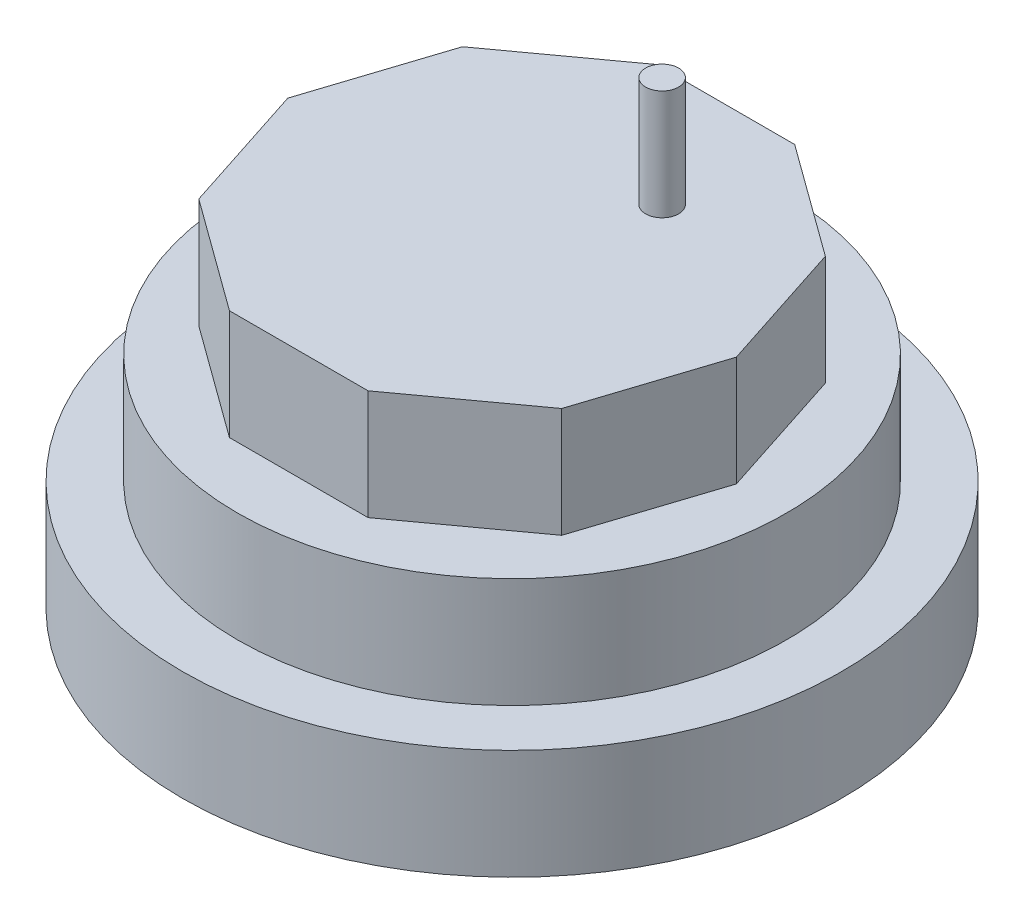
ISO-10303-21;
HEADER;
FILE_DESCRIPTION(('STEP AP214'),'2;1');
FILE_NAME('part.step','',(''),(''),'','','');
FILE_SCHEMA(('AUTOMOTIVE_DESIGN { 1 0 10303 214 1 1 1 1 }'));
ENDSEC;
DATA;
#1=APPLICATION_CONTEXT('core data for automotive mechanical design processes');
#2=APPLICATION_PROTOCOL_DEFINITION('international standard','automotive_design',2000,#1);
#3=PRODUCT_CONTEXT('',#1,'mechanical');
#4=PRODUCT('Part','Part','',(#3));
#5=PRODUCT_RELATED_PRODUCT_CATEGORY('part','',(#4));
#6=PRODUCT_DEFINITION_FORMATION('','',#4);
#7=PRODUCT_DEFINITION_CONTEXT('part definition',#1,'design');
#8=PRODUCT_DEFINITION('design','',#6,#7);
#9=PRODUCT_DEFINITION_SHAPE('','',#8);
#10=(LENGTH_UNIT() NAMED_UNIT(*) SI_UNIT(.MILLI.,.METRE.));
#11=(NAMED_UNIT(*) PLANE_ANGLE_UNIT() SI_UNIT($,.RADIAN.));
#12=(NAMED_UNIT(*) SI_UNIT($,.STERADIAN.) SOLID_ANGLE_UNIT());
#13=UNCERTAINTY_MEASURE_WITH_UNIT(LENGTH_MEASURE(1.E-05),#10,'distance_accuracy_value','');
#14=(GEOMETRIC_REPRESENTATION_CONTEXT(3) GLOBAL_UNCERTAINTY_ASSIGNED_CONTEXT((#13)) GLOBAL_UNIT_ASSIGNED_CONTEXT((#10,
#11,#12)) REPRESENTATION_CONTEXT('',''));
#15=CARTESIAN_POINT('',(0.,0.,0.));
#16=DIRECTION('',(0.,0.,1.));
#17=DIRECTION('',(1.,0.,0.));
#18=AXIS2_PLACEMENT_3D('',#15,#16,#17);
#19=CARTESIAN_POINT('',(0.,25.4,0.));
#20=DIRECTION('',(0.,-1.,0.));
#21=DIRECTION('',(0.,0.,-1.));
#22=AXIS2_PLACEMENT_3D('',#19,#20,#21);
#23=CYLINDRICAL_SURFACE('',#22,76.2);
#24=CARTESIAN_POINT('',(0.,25.4,0.));
#25=DIRECTION('',(0.,1.,0.));
#26=DIRECTION('',(0.,0.,1.));
#27=AXIS2_PLACEMENT_3D('',#24,#25,#26);
#28=CIRCLE('',#27,76.2);
#29=CARTESIAN_POINT('',(0.,25.4,76.2));
#30=VERTEX_POINT('',#29);
#31=EDGE_CURVE('E49',#30,#30,#28,.T.);
#32=ORIENTED_EDGE('',*,*,#31,.F.);
#33=EDGE_LOOP('',(#32));
#34=FACE_BOUND('',#33,.T.);
#35=CARTESIAN_POINT('',(0.,0.,0.));
#36=DIRECTION('',(0.,1.,0.));
#37=DIRECTION('',(0.,0.,1.));
#38=AXIS2_PLACEMENT_3D('',#35,#36,#37);
#39=CIRCLE('',#38,76.2);
#40=CARTESIAN_POINT('',(0.,0.,76.2));
#41=VERTEX_POINT('',#40);
#42=EDGE_CURVE('E44',#41,#41,#39,.T.);
#43=ORIENTED_EDGE('',*,*,#42,.T.);
#44=EDGE_LOOP('',(#43));
#45=FACE_BOUND('',#44,.T.);
#46=ADVANCED_FACE('F41',(#34,#45),#23,.T.);
#47=CARTESIAN_POINT('',(0.,25.4,0.));
#48=DIRECTION('',(0.,1.,0.));
#49=DIRECTION('',(0.,0.,1.));
#50=AXIS2_PLACEMENT_3D('',#47,#48,#49);
#51=PLANE('',#50);
#52=CARTESIAN_POINT('',(0.,25.4,0.));
#53=DIRECTION('',(0.,1.,0.));
#54=DIRECTION('',(0.,0.,1.));
#55=AXIS2_PLACEMENT_3D('',#52,#53,#54);
#56=CIRCLE('',#55,63.5);
#57=CARTESIAN_POINT('',(0.,25.4,63.5));
#58=VERTEX_POINT('',#57);
#59=EDGE_CURVE('E11',#58,#58,#56,.T.);
#60=ORIENTED_EDGE('',*,*,#59,.F.);
#61=EDGE_LOOP('',(#60));
#62=FACE_BOUND('',#61,.T.);
#63=ORIENTED_EDGE('',*,*,#31,.T.);
#64=EDGE_LOOP('',(#63));
#65=FACE_BOUND('',#64,.T.);
#66=ADVANCED_FACE('F156',(#62,#65),#51,.T.);
#67=CARTESIAN_POINT('',(0.,0.,0.));
#68=DIRECTION('',(0.,1.,0.));
#69=DIRECTION('',(0.,0.,1.));
#70=AXIS2_PLACEMENT_3D('',#67,#68,#69);
#71=PLANE('',#70);
#72=ORIENTED_EDGE('',*,*,#42,.F.);
#73=EDGE_LOOP('',(#72));
#74=FACE_BOUND('',#73,.T.);
#75=ADVANCED_FACE('F153',(#74),#71,.F.);
#76=CARTESIAN_POINT('',(0.,50.8,0.));
#77=DIRECTION('',(0.,-1.,0.));
#78=DIRECTION('',(0.,0.,-1.));
#79=AXIS2_PLACEMENT_3D('',#76,#77,#78);
#80=CYLINDRICAL_SURFACE('',#79,63.5);
#81=CARTESIAN_POINT('',(0.,50.8,0.));
#82=DIRECTION('',(0.,1.,0.));
#83=DIRECTION('',(0.,0.,1.));
#84=AXIS2_PLACEMENT_3D('',#81,#82,#83);
#85=CIRCLE('',#84,63.5);
#86=CARTESIAN_POINT('',(0.,50.8,63.5));
#87=VERTEX_POINT('',#86);
#88=EDGE_CURVE('E139',#87,#87,#85,.T.);
#89=ORIENTED_EDGE('',*,*,#88,.F.);
#90=EDGE_LOOP('',(#89));
#91=FACE_BOUND('',#90,.T.);
#92=ORIENTED_EDGE('',*,*,#59,.T.);
#93=EDGE_LOOP('',(#92));
#94=FACE_BOUND('',#93,.T.);
#95=ADVANCED_FACE('F155',(#91,#94),#80,.T.);
#96=CARTESIAN_POINT('',(0.,50.8,0.));
#97=DIRECTION('',(0.,1.,0.));
#98=DIRECTION('',(0.,0.,1.));
#99=AXIS2_PLACEMENT_3D('',#96,#97,#98);
#100=PLANE('',#99);
#101=DIRECTION('',(0.80901699437495,0.,-0.58778525229247));
#102=VECTOR('',#101,1.);
#103=CARTESIAN_POINT('',(16.024284297391,50.8,49.3176759770969));
#104=LINE('',#103,#102);
#105=CARTESIAN_POINT('',(16.024284297391,50.8,49.3176759770969));
#106=VERTEX_POINT('',#105);
#107=CARTESIAN_POINT('',(41.9521209359614,50.8,30.4800000000002));
#108=VERTEX_POINT('',#107);
#109=EDGE_CURVE('E57',#106,#108,#104,.T.);
#110=ORIENTED_EDGE('',*,*,#109,.F.);
#111=DIRECTION('',(1.,0.,0.));
#112=VECTOR('',#111,1.);
#113=CARTESIAN_POINT('',(-16.0242842973913,50.8,49.3176759770968));
#114=LINE('',#113,#112);
#115=CARTESIAN_POINT('',(-16.0242842973913,50.8,49.3176759770968));
#116=VERTEX_POINT('',#115);
#117=EDGE_CURVE('E61',#116,#106,#114,.T.);
#118=ORIENTED_EDGE('',*,*,#117,.F.);
#119=DIRECTION('',(0.809016994374946,0.,0.587785252292476));
#120=VECTOR('',#119,1.);
#121=CARTESIAN_POINT('',(-41.9521209359615,50.8,30.4799999999999));
#122=LINE('',#121,#120);
#123=CARTESIAN_POINT('',(-41.9521209359615,50.8,30.4799999999999));
#124=VERTEX_POINT('',#123);
#125=EDGE_CURVE('E403',#124,#116,#122,.T.);
#126=ORIENTED_EDGE('',*,*,#125,.F.);
#127=DIRECTION('',(0.309016994374944,0.,0.951056516295155));
#128=VECTOR('',#127,1.);
#129=CARTESIAN_POINT('',(-51.8556732771404,50.8,-1.89084858881472E-13));
#130=LINE('',#129,#128);
#131=CARTESIAN_POINT('',(-51.8556732771404,50.8,-1.89084858881472E-13));
#132=VERTEX_POINT('',#131);
#133=EDGE_CURVE('E400',#132,#124,#130,.T.);
#134=ORIENTED_EDGE('',*,*,#133,.F.);
#135=DIRECTION('',(-0.30901699437495,0.,0.951056516295153));
#136=VECTOR('',#135,1.);
#137=CARTESIAN_POINT('',(-41.9521209359614,50.8,-30.4800000000002));
#138=LINE('',#137,#136);
#139=CARTESIAN_POINT('',(-41.9521209359614,50.8,-30.4800000000002));
#140=VERTEX_POINT('',#139);
#141=EDGE_CURVE('E397',#140,#132,#138,.T.);
#142=ORIENTED_EDGE('',*,*,#141,.F.);
#143=DIRECTION('',(-0.809016994374949,0.,0.58778525229247));
#144=VECTOR('',#143,1.);
#145=CARTESIAN_POINT('',(-16.0242842973911,50.8,-49.3176759770969));
#146=LINE('',#145,#144);
#147=CARTESIAN_POINT('',(-16.0242842973911,50.8,-49.3176759770969));
#148=VERTEX_POINT('',#147);
#149=EDGE_CURVE('E394',#148,#140,#146,.T.);
#150=ORIENTED_EDGE('',*,*,#149,.F.);
#151=DIRECTION('',(-1.,0.,0.));
#152=VECTOR('',#151,1.);
#153=CARTESIAN_POINT('',(16.0242842973914,50.8,-49.3176759770968));
#154=LINE('',#153,#152);
#155=CARTESIAN_POINT('',(16.0242842973914,50.8,-49.3176759770968));
#156=VERTEX_POINT('',#155);
#157=EDGE_CURVE('E391',#156,#148,#154,.T.);
#158=ORIENTED_EDGE('',*,*,#157,.F.);
#159=DIRECTION('',(-0.809016994374946,0.,-0.587785252292475));
#160=VECTOR('',#159,1.);
#161=CARTESIAN_POINT('',(41.9521209359616,50.8,-30.4799999999999));
#162=LINE('',#161,#160);
#163=CARTESIAN_POINT('',(41.9521209359616,50.8,-30.4799999999999));
#164=VERTEX_POINT('',#163);
#165=EDGE_CURVE('E388',#164,#156,#162,.T.);
#166=ORIENTED_EDGE('',*,*,#165,.F.);
#167=DIRECTION('',(-0.309016994374944,0.,-0.951056516295155));
#168=VECTOR('',#167,1.);
#169=CARTESIAN_POINT('',(51.8556732771405,50.8,1.66317454907727E-13));
#170=LINE('',#169,#168);
#171=CARTESIAN_POINT('',(51.8556732771405,50.8,1.66317454907727E-13));
#172=VERTEX_POINT('',#171);
#173=EDGE_CURVE('E385',#172,#164,#170,.T.);
#174=ORIENTED_EDGE('',*,*,#173,.F.);
#175=DIRECTION('',(0.309016994374951,0.,-0.951056516295153));
#176=VECTOR('',#175,1.);
#177=CARTESIAN_POINT('',(41.9521209359614,50.8,30.4800000000002));
#178=LINE('',#177,#176);
#179=EDGE_CURVE('E364',#108,#172,#178,.T.);
#180=ORIENTED_EDGE('',*,*,#179,.F.);
#181=EDGE_LOOP('',(#110,#118,#126,#134,#142,#150,#158,#166,#174,#180));
#182=FACE_BOUND('',#181,.T.);
#183=ORIENTED_EDGE('',*,*,#88,.T.);
#184=EDGE_LOOP('',(#183));
#185=FACE_BOUND('',#184,.T.);
#186=ADVANCED_FACE('F161',(#182,#185),#100,.T.);
#187=CARTESIAN_POINT('',(16.024284297391,76.2,49.3176759770969));
#188=DIRECTION('',(-0.58778525229247,0.,-0.809016994374949));
#189=DIRECTION('',(-0.80901699437495,0.,0.58778525229247));
#190=AXIS2_PLACEMENT_3D('',#187,#188,#189);
#191=PLANE('',#190);
#192=ORIENTED_EDGE('',*,*,#109,.T.);
#193=DIRECTION('',(0.,-1.,0.));
#194=VECTOR('',#193,1.);
#195=CARTESIAN_POINT('',(41.9521209359614,76.2,30.4800000000002));
#196=LINE('',#195,#194);
#197=CARTESIAN_POINT('',(41.9521209359614,76.2,30.4800000000002));
#198=VERTEX_POINT('',#197);
#199=EDGE_CURVE('E122',#198,#108,#196,.T.);
#200=ORIENTED_EDGE('',*,*,#199,.F.);
#201=DIRECTION('',(0.80901699437495,0.,-0.58778525229247));
#202=VECTOR('',#201,1.);
#203=CARTESIAN_POINT('',(16.024284297391,76.2,49.3176759770969));
#204=LINE('',#203,#202);
#205=CARTESIAN_POINT('',(16.024284297391,76.2,49.3176759770969));
#206=VERTEX_POINT('',#205);
#207=EDGE_CURVE('E128',#206,#198,#204,.T.);
#208=ORIENTED_EDGE('',*,*,#207,.F.);
#209=DIRECTION('',(0.,-1.,0.));
#210=VECTOR('',#209,1.);
#211=CARTESIAN_POINT('',(16.024284297391,76.2,49.3176759770969));
#212=LINE('',#211,#210);
#213=EDGE_CURVE('E382',#206,#106,#212,.T.);
#214=ORIENTED_EDGE('',*,*,#213,.T.);
#215=EDGE_LOOP('',(#192,#200,#208,#214));
#216=FACE_BOUND('',#215,.T.);
#217=ADVANCED_FACE('F138',(#216),#191,.F.);
#218=CARTESIAN_POINT('',(41.9521209359614,76.2,30.4800000000002));
#219=DIRECTION('',(-0.951056516295153,0.,-0.309016994374951));
#220=DIRECTION('',(-0.309016994374951,0.,0.951056516295153));
#221=AXIS2_PLACEMENT_3D('',#218,#219,#220);
#222=PLANE('',#221);
#223=ORIENTED_EDGE('',*,*,#179,.T.);
#224=DIRECTION('',(0.,-1.,0.));
#225=VECTOR('',#224,1.);
#226=CARTESIAN_POINT('',(51.8556732771405,76.2,1.66317454907727E-13));
#227=LINE('',#226,#225);
#228=CARTESIAN_POINT('',(51.8556732771405,76.2,1.66317454907727E-13));
#229=VERTEX_POINT('',#228);
#230=EDGE_CURVE('E124',#229,#172,#227,.T.);
#231=ORIENTED_EDGE('',*,*,#230,.F.);
#232=DIRECTION('',(0.309016994374951,0.,-0.951056516295153));
#233=VECTOR('',#232,1.);
#234=CARTESIAN_POINT('',(41.9521209359614,76.2,30.4800000000002));
#235=LINE('',#234,#233);
#236=EDGE_CURVE('E117',#198,#229,#235,.T.);
#237=ORIENTED_EDGE('',*,*,#236,.F.);
#238=ORIENTED_EDGE('',*,*,#199,.T.);
#239=EDGE_LOOP('',(#223,#231,#237,#238));
#240=FACE_BOUND('',#239,.T.);
#241=ADVANCED_FACE('F120',(#240),#222,.F.);
#242=CARTESIAN_POINT('',(51.8556732771405,76.2,1.66317454907727E-13));
#243=DIRECTION('',(-0.951056516295154,0.,0.309016994374944));
#244=DIRECTION('',(0.309016994374944,0.,0.951056516295155));
#245=AXIS2_PLACEMENT_3D('',#242,#243,#244);
#246=PLANE('',#245);
#247=ORIENTED_EDGE('',*,*,#173,.T.);
#248=DIRECTION('',(0.,-1.,0.));
#249=VECTOR('',#248,1.);
#250=CARTESIAN_POINT('',(41.9521209359616,76.2,-30.4799999999999));
#251=LINE('',#250,#249);
#252=CARTESIAN_POINT('',(41.9521209359616,76.2,-30.4799999999999));
#253=VERTEX_POINT('',#252);
#254=EDGE_CURVE('E143',#253,#164,#251,.T.);
#255=ORIENTED_EDGE('',*,*,#254,.F.);
#256=DIRECTION('',(-0.309016994374944,0.,-0.951056516295155));
#257=VECTOR('',#256,1.);
#258=CARTESIAN_POINT('',(51.8556732771405,76.2,1.66317454907727E-13));
#259=LINE('',#258,#257);
#260=EDGE_CURVE('E127',#229,#253,#259,.T.);
#261=ORIENTED_EDGE('',*,*,#260,.F.);
#262=ORIENTED_EDGE('',*,*,#230,.T.);
#263=EDGE_LOOP('',(#247,#255,#261,#262));
#264=FACE_BOUND('',#263,.T.);
#265=ADVANCED_FACE('F211',(#264),#246,.F.);
#266=CARTESIAN_POINT('',(41.9521209359616,76.2,-30.4799999999999));
#267=DIRECTION('',(-0.587785252292475,0.,0.809016994374946));
#268=DIRECTION('',(0.809016994374946,0.,0.587785252292476));
#269=AXIS2_PLACEMENT_3D('',#266,#267,#268);
#270=PLANE('',#269);
#271=ORIENTED_EDGE('',*,*,#165,.T.);
#272=DIRECTION('',(0.,-1.,0.));
#273=VECTOR('',#272,1.);
#274=CARTESIAN_POINT('',(16.0242842973914,76.2,-49.3176759770968));
#275=LINE('',#274,#273);
#276=CARTESIAN_POINT('',(16.0242842973914,76.2,-49.3176759770968));
#277=VERTEX_POINT('',#276);
#278=EDGE_CURVE('E422',#277,#156,#275,.T.);
#279=ORIENTED_EDGE('',*,*,#278,.F.);
#280=DIRECTION('',(-0.809016994374946,0.,-0.587785252292475));
#281=VECTOR('',#280,1.);
#282=CARTESIAN_POINT('',(41.9521209359616,76.2,-30.4799999999999));
#283=LINE('',#282,#281);
#284=EDGE_CURVE('E370',#253,#277,#283,.T.);
#285=ORIENTED_EDGE('',*,*,#284,.F.);
#286=ORIENTED_EDGE('',*,*,#254,.T.);
#287=EDGE_LOOP('',(#271,#279,#285,#286));
#288=FACE_BOUND('',#287,.T.);
#289=ADVANCED_FACE('F221',(#288),#270,.F.);
#290=CARTESIAN_POINT('',(16.0242842973914,76.2,-49.3176759770968));
#291=DIRECTION('',(0.,0.,1.));
#292=DIRECTION('',(1.,0.,0.));
#293=AXIS2_PLACEMENT_3D('',#290,#291,#292);
#294=PLANE('',#293);
#295=ORIENTED_EDGE('',*,*,#157,.T.);
#296=DIRECTION('',(0.,-1.,0.));
#297=VECTOR('',#296,1.);
#298=CARTESIAN_POINT('',(-16.0242842973911,76.2,-49.3176759770969));
#299=LINE('',#298,#297);
#300=CARTESIAN_POINT('',(-16.0242842973911,76.2,-49.3176759770969));
#301=VERTEX_POINT('',#300);
#302=EDGE_CURVE('E419',#301,#148,#299,.T.);
#303=ORIENTED_EDGE('',*,*,#302,.F.);
#304=DIRECTION('',(-1.,0.,0.));
#305=VECTOR('',#304,1.);
#306=CARTESIAN_POINT('',(16.0242842973914,76.2,-49.3176759770968));
#307=LINE('',#306,#305);
#308=EDGE_CURVE('E372',#277,#301,#307,.T.);
#309=ORIENTED_EDGE('',*,*,#308,.F.);
#310=ORIENTED_EDGE('',*,*,#278,.T.);
#311=EDGE_LOOP('',(#295,#303,#309,#310));
#312=FACE_BOUND('',#311,.T.);
#313=ADVANCED_FACE('F232',(#312),#294,.F.);
#314=CARTESIAN_POINT('',(-16.0242842973911,76.2,-49.3176759770969));
#315=DIRECTION('',(0.58778525229247,0.,0.809016994374949));
#316=DIRECTION('',(0.80901699437495,0.,-0.58778525229247));
#317=AXIS2_PLACEMENT_3D('',#314,#315,#316);
#318=PLANE('',#317);
#319=ORIENTED_EDGE('',*,*,#149,.T.);
#320=DIRECTION('',(0.,-1.,0.));
#321=VECTOR('',#320,1.);
#322=CARTESIAN_POINT('',(-41.9521209359614,76.2,-30.4800000000002));
#323=LINE('',#322,#321);
#324=CARTESIAN_POINT('',(-41.9521209359614,76.2,-30.4800000000002));
#325=VERTEX_POINT('',#324);
#326=EDGE_CURVE('E416',#325,#140,#323,.T.);
#327=ORIENTED_EDGE('',*,*,#326,.F.);
#328=DIRECTION('',(-0.809016994374949,0.,0.58778525229247));
#329=VECTOR('',#328,1.);
#330=CARTESIAN_POINT('',(-16.0242842973911,76.2,-49.3176759770969));
#331=LINE('',#330,#329);
#332=EDGE_CURVE('E374',#301,#325,#331,.T.);
#333=ORIENTED_EDGE('',*,*,#332,.F.);
#334=ORIENTED_EDGE('',*,*,#302,.T.);
#335=EDGE_LOOP('',(#319,#327,#333,#334));
#336=FACE_BOUND('',#335,.T.);
#337=ADVANCED_FACE('F243',(#336),#318,.F.);
#338=CARTESIAN_POINT('',(-41.9521209359614,76.2,-30.4800000000002));
#339=DIRECTION('',(0.951056516295153,0.,0.30901699437495));
#340=DIRECTION('',(0.30901699437495,0.,-0.951056516295153));
#341=AXIS2_PLACEMENT_3D('',#338,#339,#340);
#342=PLANE('',#341);
#343=ORIENTED_EDGE('',*,*,#141,.T.);
#344=DIRECTION('',(0.,-1.,0.));
#345=VECTOR('',#344,1.);
#346=CARTESIAN_POINT('',(-51.8556732771404,76.2,-1.89084858881472E-13));
#347=LINE('',#346,#345);
#348=CARTESIAN_POINT('',(-51.8556732771404,76.2,-1.89084858881472E-13));
#349=VERTEX_POINT('',#348);
#350=EDGE_CURVE('E413',#349,#132,#347,.T.);
#351=ORIENTED_EDGE('',*,*,#350,.F.);
#352=DIRECTION('',(-0.30901699437495,0.,0.951056516295153));
#353=VECTOR('',#352,1.);
#354=CARTESIAN_POINT('',(-41.9521209359614,76.2,-30.4800000000002));
#355=LINE('',#354,#353);
#356=EDGE_CURVE('E376',#325,#349,#355,.T.);
#357=ORIENTED_EDGE('',*,*,#356,.F.);
#358=ORIENTED_EDGE('',*,*,#326,.T.);
#359=EDGE_LOOP('',(#343,#351,#357,#358));
#360=FACE_BOUND('',#359,.T.);
#361=ADVANCED_FACE('F254',(#360),#342,.F.);
#362=CARTESIAN_POINT('',(-51.8556732771404,76.2,-1.89084858881472E-13));
#363=DIRECTION('',(0.951056516295155,0.,-0.309016994374944));
#364=DIRECTION('',(-0.309016994374944,0.,-0.951056516295155));
#365=AXIS2_PLACEMENT_3D('',#362,#363,#364);
#366=PLANE('',#365);
#367=ORIENTED_EDGE('',*,*,#133,.T.);
#368=DIRECTION('',(0.,-1.,0.));
#369=VECTOR('',#368,1.);
#370=CARTESIAN_POINT('',(-41.9521209359615,76.2,30.4799999999999));
#371=LINE('',#370,#369);
#372=CARTESIAN_POINT('',(-41.9521209359615,76.2,30.4799999999999));
#373=VERTEX_POINT('',#372);
#374=EDGE_CURVE('E410',#373,#124,#371,.T.);
#375=ORIENTED_EDGE('',*,*,#374,.F.);
#376=DIRECTION('',(0.309016994374944,0.,0.951056516295155));
#377=VECTOR('',#376,1.);
#378=CARTESIAN_POINT('',(-51.8556732771404,76.2,-1.89084858881472E-13));
#379=LINE('',#378,#377);
#380=EDGE_CURVE('E378',#349,#373,#379,.T.);
#381=ORIENTED_EDGE('',*,*,#380,.F.);
#382=ORIENTED_EDGE('',*,*,#350,.T.);
#383=EDGE_LOOP('',(#367,#375,#381,#382));
#384=FACE_BOUND('',#383,.T.);
#385=ADVANCED_FACE('F265',(#384),#366,.F.);
#386=CARTESIAN_POINT('',(-41.9521209359615,76.2,30.4799999999999));
#387=DIRECTION('',(0.587785252292476,0.,-0.809016994374945));
#388=DIRECTION('',(-0.809016994374945,0.,-0.587785252292476));
#389=AXIS2_PLACEMENT_3D('',#386,#387,#388);
#390=PLANE('',#389);
#391=ORIENTED_EDGE('',*,*,#125,.T.);
#392=DIRECTION('',(0.,-1.,0.));
#393=VECTOR('',#392,1.);
#394=CARTESIAN_POINT('',(-16.0242842973913,76.2,49.3176759770968));
#395=LINE('',#394,#393);
#396=CARTESIAN_POINT('',(-16.0242842973913,76.2,49.3176759770968));
#397=VERTEX_POINT('',#396);
#398=EDGE_CURVE('E407',#397,#116,#395,.T.);
#399=ORIENTED_EDGE('',*,*,#398,.F.);
#400=DIRECTION('',(0.809016994374946,0.,0.587785252292476));
#401=VECTOR('',#400,1.);
#402=CARTESIAN_POINT('',(-41.9521209359615,76.2,30.4799999999999));
#403=LINE('',#402,#401);
#404=EDGE_CURVE('E380',#373,#397,#403,.T.);
#405=ORIENTED_EDGE('',*,*,#404,.F.);
#406=ORIENTED_EDGE('',*,*,#374,.T.);
#407=EDGE_LOOP('',(#391,#399,#405,#406));
#408=FACE_BOUND('',#407,.T.);
#409=ADVANCED_FACE('F276',(#408),#390,.F.);
#410=CARTESIAN_POINT('',(-16.0242842973913,76.2,49.3176759770968));
#411=DIRECTION('',(0.,0.,-1.));
#412=DIRECTION('',(-1.,0.,0.));
#413=AXIS2_PLACEMENT_3D('',#410,#411,#412);
#414=PLANE('',#413);
#415=ORIENTED_EDGE('',*,*,#117,.T.);
#416=ORIENTED_EDGE('',*,*,#213,.F.);
#417=DIRECTION('',(1.,0.,0.));
#418=VECTOR('',#417,1.);
#419=CARTESIAN_POINT('',(-16.0242842973913,76.2,49.3176759770968));
#420=LINE('',#419,#418);
#421=EDGE_CURVE('E133',#397,#206,#420,.T.);
#422=ORIENTED_EDGE('',*,*,#421,.F.);
#423=ORIENTED_EDGE('',*,*,#398,.T.);
#424=EDGE_LOOP('',(#415,#416,#422,#423));
#425=FACE_BOUND('',#424,.T.);
#426=ADVANCED_FACE('F287',(#425),#414,.F.);
#427=CARTESIAN_POINT('',(0.,76.2,0.));
#428=DIRECTION('',(0.,1.,0.));
#429=DIRECTION('',(0.,0.,1.));
#430=AXIS2_PLACEMENT_3D('',#427,#428,#429);
#431=PLANE('',#430);
#432=CARTESIAN_POINT('',(12.6999999999999,76.2,-21.9970452561248));
#433=DIRECTION('',(0.,1.,0.));
#434=DIRECTION('',(0.,0.,1.));
#435=AXIS2_PLACEMENT_3D('',#432,#433,#434);
#436=CIRCLE('',#435,3.81);
#437=CARTESIAN_POINT('',(12.6999999999999,76.2,-18.1870452561248));
#438=VERTEX_POINT('',#437);
#439=EDGE_CURVE('E362',#438,#438,#436,.T.);
#440=ORIENTED_EDGE('',*,*,#439,.F.);
#441=EDGE_LOOP('',(#440));
#442=FACE_BOUND('',#441,.T.);
#443=ORIENTED_EDGE('',*,*,#207,.T.);
#444=ORIENTED_EDGE('',*,*,#236,.T.);
#445=ORIENTED_EDGE('',*,*,#260,.T.);
#446=ORIENTED_EDGE('',*,*,#284,.T.);
#447=ORIENTED_EDGE('',*,*,#308,.T.);
#448=ORIENTED_EDGE('',*,*,#332,.T.);
#449=ORIENTED_EDGE('',*,*,#356,.T.);
#450=ORIENTED_EDGE('',*,*,#380,.T.);
#451=ORIENTED_EDGE('',*,*,#404,.T.);
#452=ORIENTED_EDGE('',*,*,#421,.T.);
#453=EDGE_LOOP('',(#443,#444,#445,#446,#447,#448,#449,#450,#451,#452));
#454=FACE_BOUND('',#453,.T.);
#455=ADVANCED_FACE('F131',(#442,#454),#431,.T.);
#456=CARTESIAN_POINT('',(12.6999999999999,101.6,-21.9970452561248));
#457=DIRECTION('',(0.,-1.,0.));
#458=DIRECTION('',(0.,0.,-1.));
#459=AXIS2_PLACEMENT_3D('',#456,#457,#458);
#460=CYLINDRICAL_SURFACE('',#459,3.81);
#461=CARTESIAN_POINT('',(12.6999999999999,101.6,-21.9970452561248));
#462=DIRECTION('',(0.,1.,0.));
#463=DIRECTION('',(0.,0.,1.));
#464=AXIS2_PLACEMENT_3D('',#461,#462,#463);
#465=CIRCLE('',#464,3.81);
#466=CARTESIAN_POINT('',(12.6999999999999,101.6,-18.1870452561248));
#467=VERTEX_POINT('',#466);
#468=EDGE_CURVE('E361',#467,#467,#465,.T.);
#469=ORIENTED_EDGE('',*,*,#468,.F.);
#470=EDGE_LOOP('',(#469));
#471=FACE_BOUND('',#470,.T.);
#472=ORIENTED_EDGE('',*,*,#439,.T.);
#473=EDGE_LOOP('',(#472));
#474=FACE_BOUND('',#473,.T.);
#475=ADVANCED_FACE('F308',(#471,#474),#460,.T.);
#476=CARTESIAN_POINT('',(12.6999999999999,101.6,-21.9970452561248));
#477=DIRECTION('',(0.,1.,0.));
#478=DIRECTION('',(0.,0.,1.));
#479=AXIS2_PLACEMENT_3D('',#476,#477,#478);
#480=PLANE('',#479);
#481=ORIENTED_EDGE('',*,*,#468,.T.);
#482=EDGE_LOOP('',(#481));
#483=FACE_BOUND('',#482,.T.);
#484=ADVANCED_FACE('F319',(#483),#480,.T.);
#485=CLOSED_SHELL('',(#46,#66,#75,#95,#186,#217,#241,#265,#289,#313,#337,#361,#385,#409,#426,
#455,#475,#484));
#486=MANIFOLD_SOLID_BREP('B2',#485);
#487=ADVANCED_BREP_SHAPE_REPRESENTATION('',(#18,#486),#14);
#488=SHAPE_DEFINITION_REPRESENTATION(#9,#487);
ENDSEC;
END-ISO-10303-21;
